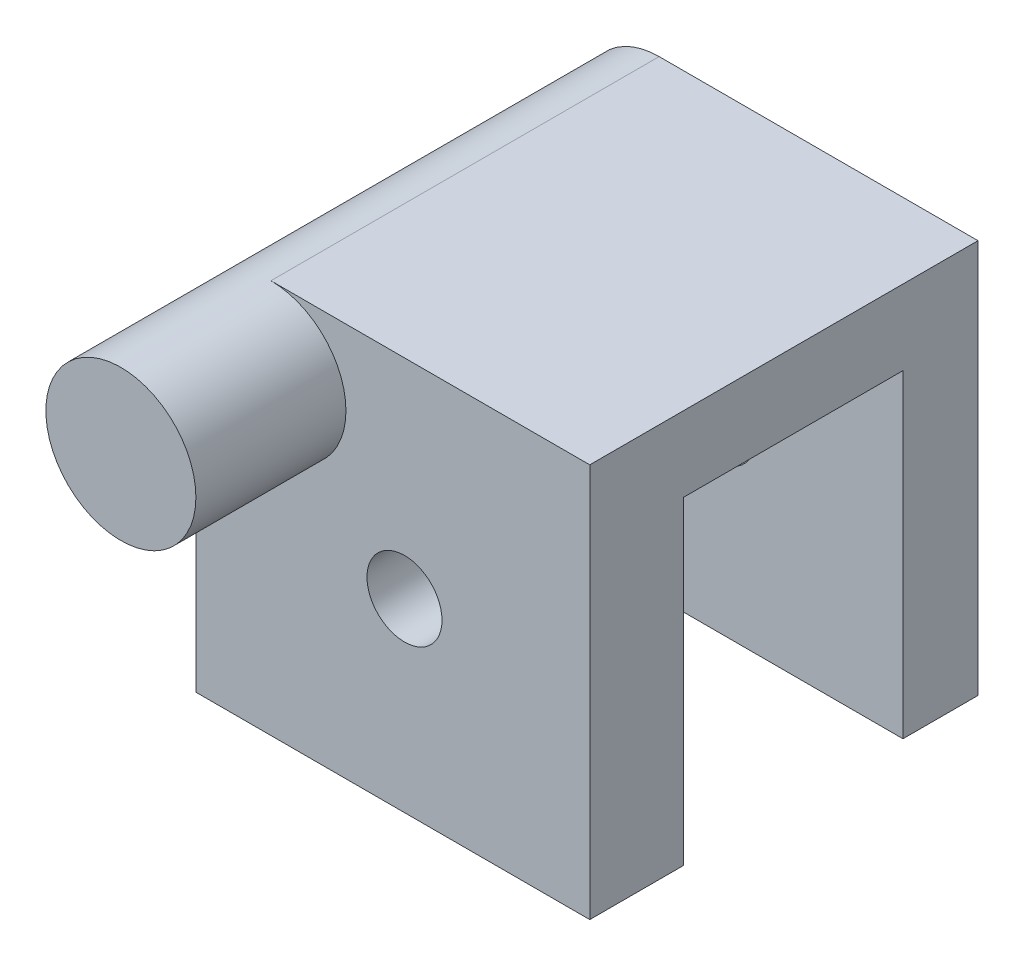
ISO-10303-21;
HEADER;
FILE_DESCRIPTION(('STEP AP214'),'2;1');
FILE_NAME('part.step','',(''),(''),'','','');
FILE_SCHEMA(('AUTOMOTIVE_DESIGN { 1 0 10303 214 1 1 1 1 }'));
ENDSEC;
DATA;
#1=APPLICATION_CONTEXT('core data for automotive mechanical design processes');
#2=APPLICATION_PROTOCOL_DEFINITION('international standard','automotive_design',2000,#1);
#3=PRODUCT_CONTEXT('',#1,'mechanical');
#4=PRODUCT('Part','Part','',(#3));
#5=PRODUCT_RELATED_PRODUCT_CATEGORY('part','',(#4));
#6=PRODUCT_DEFINITION_FORMATION('','',#4);
#7=PRODUCT_DEFINITION_CONTEXT('part definition',#1,'design');
#8=PRODUCT_DEFINITION('design','',#6,#7);
#9=PRODUCT_DEFINITION_SHAPE('','',#8);
#10=(LENGTH_UNIT() NAMED_UNIT(*) SI_UNIT(.MILLI.,.METRE.));
#11=(NAMED_UNIT(*) PLANE_ANGLE_UNIT() SI_UNIT($,.RADIAN.));
#12=(NAMED_UNIT(*) SI_UNIT($,.STERADIAN.) SOLID_ANGLE_UNIT());
#13=UNCERTAINTY_MEASURE_WITH_UNIT(LENGTH_MEASURE(1.E-05),#10,'distance_accuracy_value','');
#14=(GEOMETRIC_REPRESENTATION_CONTEXT(3) GLOBAL_UNCERTAINTY_ASSIGNED_CONTEXT((#13)) GLOBAL_UNIT_ASSIGNED_CONTEXT((#10,
#11,#12)) REPRESENTATION_CONTEXT('',''));
#15=CARTESIAN_POINT('',(0.,0.,0.));
#16=DIRECTION('',(0.,0.,1.));
#17=DIRECTION('',(1.,0.,0.));
#18=AXIS2_PLACEMENT_3D('',#15,#16,#17);
#19=CARTESIAN_POINT('',(-46.,0.,-41.398484809835));
#20=DIRECTION('',(1.,0.,0.));
#21=DIRECTION('',(0.,0.,-1.));
#22=AXIS2_PLACEMENT_3D('',#19,#20,#21);
#23=PLANE('',#22);
#24=DIRECTION('',(0.,0.,1.));
#25=VECTOR('',#24,1.);
#26=CARTESIAN_POINT('',(-46.,-21.,-41.398484809835));
#27=LINE('',#26,#25);
#28=CARTESIAN_POINT('',(-46.,-21.,-11.7));
#29=VERTEX_POINT('',#28);
#30=CARTESIAN_POINT('',(-46.,-21.,0.));
#31=VERTEX_POINT('',#30);
#32=EDGE_CURVE('E233',#29,#31,#27,.T.);
#33=ORIENTED_EDGE('',*,*,#32,.F.);
#34=DIRECTION('',(0.,1.,0.));
#35=VECTOR('',#34,1.);
#36=CARTESIAN_POINT('',(-46.,0.,-11.7));
#37=LINE('',#36,#35);
#38=CARTESIAN_POINT('',(-46.,-8.00000000000001,-11.7));
#39=VERTEX_POINT('',#38);
#40=EDGE_CURVE('E82',#29,#39,#37,.T.);
#41=ORIENTED_EDGE('',*,*,#40,.T.);
#42=DIRECTION('',(0.,0.,1.));
#43=VECTOR('',#42,1.);
#44=CARTESIAN_POINT('',(-46.,-8.00000000000001,-41.398484809835));
#45=LINE('',#44,#43);
#46=CARTESIAN_POINT('',(-46.,-8.00000000000001,0.));
#47=VERTEX_POINT('',#46);
#48=EDGE_CURVE('E231',#39,#47,#45,.T.);
#49=ORIENTED_EDGE('',*,*,#48,.T.);
#50=DIRECTION('',(0.,-1.,0.));
#51=VECTOR('',#50,1.);
#52=CARTESIAN_POINT('',(-46.,0.,0.));
#53=LINE('',#52,#51);
#54=EDGE_CURVE('E213',#47,#31,#53,.T.);
#55=ORIENTED_EDGE('',*,*,#54,.T.);
#56=EDGE_LOOP('',(#33,#41,#49,#55));
#57=FACE_BOUND('',#56,.T.);
#58=ADVANCED_FACE('F67',(#57),#23,.T.);
#59=CARTESIAN_POINT('',(0.,-4.,-41.398484809835));
#60=DIRECTION('',(0.,1.,0.));
#61=DIRECTION('',(0.,0.,1.));
#62=AXIS2_PLACEMENT_3D('',#59,#60,#61);
#63=PLANE('',#62);
#64=DIRECTION('',(-1.,0.,0.));
#65=VECTOR('',#64,1.);
#66=CARTESIAN_POINT('',(0.,-4.,-11.7));
#67=LINE('',#66,#65);
#68=CARTESIAN_POINT('',(-29.,-4.,-11.7));
#69=VERTEX_POINT('',#68);
#70=CARTESIAN_POINT('',(-42.,-4.,-11.7));
#71=VERTEX_POINT('',#70);
#72=EDGE_CURVE('E90',#69,#71,#67,.T.);
#73=ORIENTED_EDGE('',*,*,#72,.F.);
#74=DIRECTION('',(0.,0.,1.));
#75=VECTOR('',#74,1.);
#76=CARTESIAN_POINT('',(-29.,-4.,-41.398484809835));
#77=LINE('',#76,#75);
#78=CARTESIAN_POINT('',(-29.,-4.,0.));
#79=VERTEX_POINT('',#78);
#80=EDGE_CURVE('E235',#69,#79,#77,.T.);
#81=ORIENTED_EDGE('',*,*,#80,.T.);
#82=DIRECTION('',(1.,0.,0.));
#83=VECTOR('',#82,1.);
#84=CARTESIAN_POINT('',(0.,-4.,0.));
#85=LINE('',#84,#83);
#86=CARTESIAN_POINT('',(-42.,-4.,0.));
#87=VERTEX_POINT('',#86);
#88=EDGE_CURVE('E206',#87,#79,#85,.T.);
#89=ORIENTED_EDGE('',*,*,#88,.F.);
#90=DIRECTION('',(0.,0.,1.));
#91=VECTOR('',#90,1.);
#92=CARTESIAN_POINT('',(-42.,-4.,-41.398484809835));
#93=LINE('',#92,#91);
#94=EDGE_CURVE('E230',#71,#87,#93,.T.);
#95=ORIENTED_EDGE('',*,*,#94,.F.);
#96=EDGE_LOOP('',(#73,#81,#89,#95));
#97=FACE_BOUND('',#96,.T.);
#98=ADVANCED_FACE('F263',(#97),#63,.F.);
#99=CARTESIAN_POINT('',(-46.,-4.,-41.398484809835));
#100=DIRECTION('',(0.,0.,1.));
#101=DIRECTION('',(1.,0.,0.));
#102=AXIS2_PLACEMENT_3D('',#99,#100,#101);
#103=CYLINDRICAL_SURFACE('',#102,4.00000000000001);
#104=ORIENTED_EDGE('',*,*,#94,.T.);
#105=CARTESIAN_POINT('',(-46.,-4.,0.));
#106=DIRECTION('',(0.,0.,1.));
#107=DIRECTION('',(1.,0.,0.));
#108=AXIS2_PLACEMENT_3D('',#105,#106,#107);
#109=CIRCLE('',#108,4.00000000000001);
#110=EDGE_CURVE('E187',#47,#87,#109,.T.);
#111=ORIENTED_EDGE('',*,*,#110,.F.);
#112=ORIENTED_EDGE('',*,*,#48,.F.);
#113=CARTESIAN_POINT('',(-46.,-4.,-11.7));
#114=DIRECTION('',(0.,0.,-1.));
#115=DIRECTION('',(0.,1.,0.));
#116=AXIS2_PLACEMENT_3D('',#113,#114,#115);
#117=CIRCLE('',#116,4.00000000000001);
#118=EDGE_CURVE('E227',#39,#71,#117,.F.);
#119=ORIENTED_EDGE('',*,*,#118,.T.);
#120=EDGE_LOOP('',(#104,#111,#112,#119));
#121=FACE_BOUND('',#120,.T.);
#122=ADVANCED_FACE('F265',(#121),#103,.T.);
#123=DIRECTION('',(0.,0.,1.));
#124=VECTOR('',#123,1.);
#125=CARTESIAN_POINT('',(-50.,-4.,-41.398484809835));
#126=LINE('',#125,#124);
#127=CARTESIAN_POINT('',(-50.,-4.,-15.7));
#128=VERTEX_POINT('',#127);
#129=CARTESIAN_POINT('',(-50.,-4.,5.));
#130=VERTEX_POINT('',#129);
#131=EDGE_CURVE('E226',#128,#130,#126,.T.);
#132=ORIENTED_EDGE('',*,*,#131,.T.);
#133=CARTESIAN_POINT('',(-46.,-4.,5.));
#134=DIRECTION('',(0.,0.,1.));
#135=DIRECTION('',(1.,0.,0.));
#136=AXIS2_PLACEMENT_3D('',#133,#134,#135);
#137=CIRCLE('',#136,4.00000000000001);
#138=CARTESIAN_POINT('',(-46.,0.,5.));
#139=VERTEX_POINT('',#138);
#140=EDGE_CURVE('E188',#130,#139,#137,.T.);
#141=ORIENTED_EDGE('',*,*,#140,.T.);
#142=DIRECTION('',(0.,0.,1.));
#143=VECTOR('',#142,1.);
#144=CARTESIAN_POINT('',(-46.,0.,-41.398484809835));
#145=LINE('',#144,#143);
#146=CARTESIAN_POINT('',(-46.,0.,-15.7));
#147=VERTEX_POINT('',#146);
#148=EDGE_CURVE('E12',#147,#139,#145,.T.);
#149=ORIENTED_EDGE('',*,*,#148,.F.);
#150=CARTESIAN_POINT('',(-46.,-4.,-15.7));
#151=DIRECTION('',(0.,0.,-1.));
#152=DIRECTION('',(0.,1.,0.));
#153=AXIS2_PLACEMENT_3D('',#150,#151,#152);
#154=CIRCLE('',#153,4.00000000000001);
#155=EDGE_CURVE('E222',#128,#147,#154,.T.);
#156=ORIENTED_EDGE('',*,*,#155,.F.);
#157=EDGE_LOOP('',(#132,#141,#149,#156));
#158=FACE_BOUND('',#157,.T.);
#159=CARTESIAN_POINT('',(-46.,-4.,13.));
#160=DIRECTION('',(0.,0.,1.));
#161=DIRECTION('',(1.,0.,0.));
#162=AXIS2_PLACEMENT_3D('',#159,#160,#161);
#163=CIRCLE('',#162,4.00000000000001);
#164=CARTESIAN_POINT('',(-42.,-4.,13.));
#165=VERTEX_POINT('',#164);
#166=EDGE_CURVE('E182',#165,#165,#163,.T.);
#167=ORIENTED_EDGE('',*,*,#166,.F.);
#168=EDGE_LOOP('',(#167));
#169=FACE_BOUND('',#168,.T.);
#170=ADVANCED_FACE('F69',(#158,#169),#103,.T.);
#171=CARTESIAN_POINT('',(-50.,0.,-41.398484809835));
#172=DIRECTION('',(1.,0.,0.));
#173=DIRECTION('',(0.,0.,-1.));
#174=AXIS2_PLACEMENT_3D('',#171,#172,#173);
#175=PLANE('',#174);
#176=ORIENTED_EDGE('',*,*,#131,.F.);
#177=DIRECTION('',(0.,-1.,0.));
#178=VECTOR('',#177,1.);
#179=CARTESIAN_POINT('',(-50.,0.,-15.7));
#180=LINE('',#179,#178);
#181=CARTESIAN_POINT('',(-50.,-21.,-15.7));
#182=VERTEX_POINT('',#181);
#183=EDGE_CURVE('E155',#128,#182,#180,.T.);
#184=ORIENTED_EDGE('',*,*,#183,.T.);
#185=DIRECTION('',(0.,0.,1.));
#186=VECTOR('',#185,1.);
#187=CARTESIAN_POINT('',(-50.,-21.,-41.398484809835));
#188=LINE('',#187,#186);
#189=CARTESIAN_POINT('',(-50.,-21.,5.));
#190=VERTEX_POINT('',#189);
#191=EDGE_CURVE('E151',#182,#190,#188,.T.);
#192=ORIENTED_EDGE('',*,*,#191,.T.);
#193=DIRECTION('',(0.,1.,0.));
#194=VECTOR('',#193,1.);
#195=CARTESIAN_POINT('',(-50.,0.,5.));
#196=LINE('',#195,#194);
#197=EDGE_CURVE('E191',#190,#130,#196,.T.);
#198=ORIENTED_EDGE('',*,*,#197,.T.);
#199=EDGE_LOOP('',(#176,#184,#192,#198));
#200=FACE_BOUND('',#199,.T.);
#201=ADVANCED_FACE('F253',(#200),#175,.F.);
#202=CARTESIAN_POINT('',(0.,-21.,-41.398484809835));
#203=DIRECTION('',(0.,1.,0.));
#204=DIRECTION('',(-1.,0.,0.));
#205=AXIS2_PLACEMENT_3D('',#202,#203,#204);
#206=PLANE('',#205);
#207=ORIENTED_EDGE('',*,*,#191,.F.);
#208=DIRECTION('',(1.,0.,0.));
#209=VECTOR('',#208,1.);
#210=CARTESIAN_POINT('',(0.,-21.,-15.7));
#211=LINE('',#210,#209);
#212=CARTESIAN_POINT('',(-29.,-21.,-15.7));
#213=VERTEX_POINT('',#212);
#214=EDGE_CURVE('E143',#182,#213,#211,.T.);
#215=ORIENTED_EDGE('',*,*,#214,.T.);
#216=DIRECTION('',(0.,0.,-1.));
#217=VECTOR('',#216,1.);
#218=CARTESIAN_POINT('',(-29.,-21.,12.3416305603426));
#219=LINE('',#218,#217);
#220=CARTESIAN_POINT('',(-29.,-21.,-11.7));
#221=VERTEX_POINT('',#220);
#222=EDGE_CURVE('E148',#221,#213,#219,.T.);
#223=ORIENTED_EDGE('',*,*,#222,.F.);
#224=DIRECTION('',(1.,0.,0.));
#225=VECTOR('',#224,1.);
#226=CARTESIAN_POINT('',(-46.,-21.,-11.7));
#227=LINE('',#226,#225);
#228=EDGE_CURVE('E172',#29,#221,#227,.T.);
#229=ORIENTED_EDGE('',*,*,#228,.F.);
#230=ORIENTED_EDGE('',*,*,#32,.T.);
#231=DIRECTION('',(1.,0.,0.));
#232=VECTOR('',#231,1.);
#233=CARTESIAN_POINT('',(0.,-21.,0.));
#234=LINE('',#233,#232);
#235=CARTESIAN_POINT('',(-28.9999999999999,-21.,0.));
#236=VERTEX_POINT('',#235);
#237=EDGE_CURVE('E180',#31,#236,#234,.T.);
#238=ORIENTED_EDGE('',*,*,#237,.T.);
#239=DIRECTION('',(0.,0.,1.));
#240=VECTOR('',#239,1.);
#241=CARTESIAN_POINT('',(-28.9999999999999,-21.,-24.0416305603426));
#242=LINE('',#241,#240);
#243=CARTESIAN_POINT('',(-28.9999999999999,-21.,5.00000000000012));
#244=VERTEX_POINT('',#243);
#245=EDGE_CURVE('E176',#236,#244,#242,.T.);
#246=ORIENTED_EDGE('',*,*,#245,.T.);
#247=DIRECTION('',(-1.,0.,0.));
#248=VECTOR('',#247,1.);
#249=CARTESIAN_POINT('',(0.,-21.,5.));
#250=LINE('',#249,#248);
#251=EDGE_CURVE('E195',#244,#190,#250,.T.);
#252=ORIENTED_EDGE('',*,*,#251,.T.);
#253=EDGE_LOOP('',(#207,#215,#223,#229,#230,#238,#246,#252));
#254=FACE_BOUND('',#253,.T.);
#255=ADVANCED_FACE('F145',(#254),#206,.F.);
#256=CARTESIAN_POINT('',(-29.,0.,-41.398484809835));
#257=DIRECTION('',(1.,0.,0.));
#258=DIRECTION('',(0.,0.,-1.));
#259=AXIS2_PLACEMENT_3D('',#256,#257,#258);
#260=PLANE('',#259);
#261=ORIENTED_EDGE('',*,*,#80,.F.);
#262=DIRECTION('',(0.,-1.,0.));
#263=VECTOR('',#262,1.);
#264=CARTESIAN_POINT('',(-29.,-3.99999999999999,-11.7));
#265=LINE('',#264,#263);
#266=EDGE_CURVE('E170',#69,#221,#265,.T.);
#267=ORIENTED_EDGE('',*,*,#266,.T.);
#268=ORIENTED_EDGE('',*,*,#222,.T.);
#269=DIRECTION('',(0.,-1.,0.));
#270=VECTOR('',#269,1.);
#271=CARTESIAN_POINT('',(-29.,0.,-15.7));
#272=LINE('',#271,#270);
#273=CARTESIAN_POINT('',(-29.,0.,-15.7));
#274=VERTEX_POINT('',#273);
#275=EDGE_CURVE('E156',#274,#213,#272,.T.);
#276=ORIENTED_EDGE('',*,*,#275,.F.);
#277=DIRECTION('',(0.,0.,1.));
#278=VECTOR('',#277,1.);
#279=CARTESIAN_POINT('',(-29.,0.,-41.398484809835));
#280=LINE('',#279,#278);
#281=CARTESIAN_POINT('',(-29.,0.,5.));
#282=VERTEX_POINT('',#281);
#283=EDGE_CURVE('E75',#274,#282,#280,.T.);
#284=ORIENTED_EDGE('',*,*,#283,.T.);
#285=DIRECTION('',(0.,1.,0.));
#286=VECTOR('',#285,1.);
#287=CARTESIAN_POINT('',(-29.,0.,5.));
#288=LINE('',#287,#286);
#289=EDGE_CURVE('E197',#244,#282,#288,.T.);
#290=ORIENTED_EDGE('',*,*,#289,.F.);
#291=ORIENTED_EDGE('',*,*,#245,.F.);
#292=DIRECTION('',(0.,-1.,0.));
#293=VECTOR('',#292,1.);
#294=CARTESIAN_POINT('',(-29.,0.,0.));
#295=LINE('',#294,#293);
#296=EDGE_CURVE('E179',#79,#236,#295,.T.);
#297=ORIENTED_EDGE('',*,*,#296,.F.);
#298=EDGE_LOOP('',(#261,#267,#268,#276,#284,#290,#291,#297));
#299=FACE_BOUND('',#298,.T.);
#300=ADVANCED_FACE('F168',(#299),#260,.T.);
#301=CARTESIAN_POINT('',(0.,0.,-41.398484809835));
#302=DIRECTION('',(0.,1.,0.));
#303=DIRECTION('',(-1.,0.,0.));
#304=AXIS2_PLACEMENT_3D('',#301,#302,#303);
#305=PLANE('',#304);
#306=ORIENTED_EDGE('',*,*,#283,.F.);
#307=DIRECTION('',(1.,0.,0.));
#308=VECTOR('',#307,1.);
#309=CARTESIAN_POINT('',(0.,0.,-15.7));
#310=LINE('',#309,#308);
#311=EDGE_CURVE('E164',#147,#274,#310,.T.);
#312=ORIENTED_EDGE('',*,*,#311,.F.);
#313=ORIENTED_EDGE('',*,*,#148,.T.);
#314=DIRECTION('',(-1.,0.,0.));
#315=VECTOR('',#314,1.);
#316=CARTESIAN_POINT('',(0.,0.,5.));
#317=LINE('',#316,#315);
#318=EDGE_CURVE('E200',#282,#139,#317,.T.);
#319=ORIENTED_EDGE('',*,*,#318,.F.);
#320=EDGE_LOOP('',(#306,#312,#313,#319));
#321=FACE_BOUND('',#320,.T.);
#322=ADVANCED_FACE('F255',(#321),#305,.T.);
#323=CARTESIAN_POINT('',(-46.,-4.,-11.7));
#324=DIRECTION('',(0.,0.,-1.));
#325=DIRECTION('',(0.,1.,0.));
#326=AXIS2_PLACEMENT_3D('',#323,#324,#325);
#327=PLANE('',#326);
#328=ORIENTED_EDGE('',*,*,#266,.F.);
#329=ORIENTED_EDGE('',*,*,#72,.T.);
#330=ORIENTED_EDGE('',*,*,#118,.F.);
#331=ORIENTED_EDGE('',*,*,#40,.F.);
#332=ORIENTED_EDGE('',*,*,#228,.T.);
#333=EDGE_LOOP('',(#328,#329,#330,#331,#332));
#334=FACE_BOUND('',#333,.T.);
#335=CARTESIAN_POINT('',(-38.8786796564403,-11.1213203435596,-11.7));
#336=DIRECTION('',(0.,0.,-1.));
#337=DIRECTION('',(0.,1.,0.));
#338=AXIS2_PLACEMENT_3D('',#335,#336,#337);
#339=CIRCLE('',#338,2.);
#340=CARTESIAN_POINT('',(-36.8786796564403,-11.1213203435596,-11.7));
#341=VERTEX_POINT('',#340);
#342=EDGE_CURVE('E216',#341,#341,#339,.T.);
#343=ORIENTED_EDGE('',*,*,#342,.T.);
#344=EDGE_LOOP('',(#343));
#345=FACE_BOUND('',#344,.T.);
#346=ADVANCED_FACE('F267',(#334,#345),#327,.F.);
#347=CARTESIAN_POINT('',(-46.,-4.,-15.7));
#348=DIRECTION('',(0.,0.,-1.));
#349=DIRECTION('',(0.,1.,0.));
#350=AXIS2_PLACEMENT_3D('',#347,#348,#349);
#351=PLANE('',#350);
#352=ORIENTED_EDGE('',*,*,#275,.T.);
#353=ORIENTED_EDGE('',*,*,#214,.F.);
#354=ORIENTED_EDGE('',*,*,#183,.F.);
#355=ORIENTED_EDGE('',*,*,#155,.T.);
#356=ORIENTED_EDGE('',*,*,#311,.T.);
#357=EDGE_LOOP('',(#352,#353,#354,#355,#356));
#358=FACE_BOUND('',#357,.T.);
#359=CARTESIAN_POINT('',(-38.8786796564403,-11.1213203435596,-15.7));
#360=DIRECTION('',(0.,0.,-1.));
#361=DIRECTION('',(0.,1.,0.));
#362=AXIS2_PLACEMENT_3D('',#359,#360,#361);
#363=CIRCLE('',#362,2.);
#364=CARTESIAN_POINT('',(-36.8786796564403,-11.1213203435596,-15.7));
#365=VERTEX_POINT('',#364);
#366=EDGE_CURVE('E166',#365,#365,#363,.T.);
#367=ORIENTED_EDGE('',*,*,#366,.F.);
#368=EDGE_LOOP('',(#367));
#369=FACE_BOUND('',#368,.T.);
#370=ADVANCED_FACE('F160',(#358,#369),#351,.T.);
#371=CARTESIAN_POINT('',(-38.8786796564403,-11.1213203435596,-15.7));
#372=DIRECTION('',(0.,0.,1.));
#373=DIRECTION('',(1.,0.,0.));
#374=AXIS2_PLACEMENT_3D('',#371,#372,#373);
#375=CYLINDRICAL_SURFACE('',#374,2.);
#376=CARTESIAN_POINT('',(-36.8786796564403,-11.1213203435596,-15.7));
#377=CARTESIAN_POINT('',(-36.8786796564403,-11.1213203435596,-15.6583333333333));
#378=CARTESIAN_POINT('',(-36.8786796564403,-11.1213203435596,-15.6166666666667));
#379=CARTESIAN_POINT('',(-36.8786796564403,-11.1213203435596,-15.5333333333333));
#380=CARTESIAN_POINT('',(-36.8786796564403,-11.1213203435596,-15.4916666666667));
#381=CARTESIAN_POINT('',(-36.8786796564403,-11.1213203435596,-15.4083333333333));
#382=CARTESIAN_POINT('',(-36.8786796564403,-11.1213203435596,-15.3666666666667));
#383=CARTESIAN_POINT('',(-36.8786796564403,-11.1213203435596,-15.2833333333333));
#384=CARTESIAN_POINT('',(-36.8786796564403,-11.1213203435596,-15.2416666666667));
#385=CARTESIAN_POINT('',(-36.8786796564403,-11.1213203435596,-15.1583333333333));
#386=CARTESIAN_POINT('',(-36.8786796564403,-11.1213203435596,-15.1166666666667));
#387=CARTESIAN_POINT('',(-36.8786796564403,-11.1213203435596,-15.0333333333333));
#388=CARTESIAN_POINT('',(-36.8786796564403,-11.1213203435596,-14.9916666666667));
#389=CARTESIAN_POINT('',(-36.8786796564403,-11.1213203435596,-14.9083333333333));
#390=CARTESIAN_POINT('',(-36.8786796564403,-11.1213203435596,-14.8666666666667));
#391=CARTESIAN_POINT('',(-36.8786796564403,-11.1213203435596,-14.7833333333333));
#392=CARTESIAN_POINT('',(-36.8786796564403,-11.1213203435596,-14.7416666666667));
#393=CARTESIAN_POINT('',(-36.8786796564403,-11.1213203435596,-14.6583333333333));
#394=CARTESIAN_POINT('',(-36.8786796564403,-11.1213203435596,-14.6166666666667));
#395=CARTESIAN_POINT('',(-36.8786796564403,-11.1213203435596,-14.5333333333333));
#396=CARTESIAN_POINT('',(-36.8786796564403,-11.1213203435596,-14.4916666666667));
#397=CARTESIAN_POINT('',(-36.8786796564403,-11.1213203435596,-14.4083333333333));
#398=CARTESIAN_POINT('',(-36.8786796564403,-11.1213203435596,-14.3666666666667));
#399=CARTESIAN_POINT('',(-36.8786796564403,-11.1213203435596,-14.2833333333333));
#400=CARTESIAN_POINT('',(-36.8786796564403,-11.1213203435596,-14.2416666666667));
#401=CARTESIAN_POINT('',(-36.8786796564403,-11.1213203435596,-14.1583333333333));
#402=CARTESIAN_POINT('',(-36.8786796564403,-11.1213203435596,-14.1166666666667));
#403=CARTESIAN_POINT('',(-36.8786796564403,-11.1213203435596,-14.0333333333333));
#404=CARTESIAN_POINT('',(-36.8786796564403,-11.1213203435596,-13.9916666666667));
#405=CARTESIAN_POINT('',(-36.8786796564403,-11.1213203435596,-13.9083333333333));
#406=CARTESIAN_POINT('',(-36.8786796564403,-11.1213203435596,-13.8666666666667));
#407=CARTESIAN_POINT('',(-36.8786796564403,-11.1213203435596,-13.7833333333333));
#408=CARTESIAN_POINT('',(-36.8786796564403,-11.1213203435596,-13.7416666666667));
#409=CARTESIAN_POINT('',(-36.8786796564403,-11.1213203435596,-13.6583333333333));
#410=CARTESIAN_POINT('',(-36.8786796564403,-11.1213203435596,-13.6166666666667));
#411=CARTESIAN_POINT('',(-36.8786796564403,-11.1213203435596,-13.5333333333333));
#412=CARTESIAN_POINT('',(-36.8786796564403,-11.1213203435596,-13.4916666666667));
#413=CARTESIAN_POINT('',(-36.8786796564403,-11.1213203435596,-13.4083333333333));
#414=CARTESIAN_POINT('',(-36.8786796564403,-11.1213203435596,-13.3666666666667));
#415=CARTESIAN_POINT('',(-36.8786796564403,-11.1213203435596,-13.2833333333333));
#416=CARTESIAN_POINT('',(-36.8786796564403,-11.1213203435596,-13.2416666666667));
#417=CARTESIAN_POINT('',(-36.8786796564403,-11.1213203435596,-13.1583333333333));
#418=CARTESIAN_POINT('',(-36.8786796564403,-11.1213203435596,-13.1166666666667));
#419=CARTESIAN_POINT('',(-36.8786796564403,-11.1213203435596,-13.0333333333333));
#420=CARTESIAN_POINT('',(-36.8786796564403,-11.1213203435596,-12.9916666666667));
#421=CARTESIAN_POINT('',(-36.8786796564403,-11.1213203435596,-12.9083333333333));
#422=CARTESIAN_POINT('',(-36.8786796564403,-11.1213203435596,-12.8666666666667));
#423=CARTESIAN_POINT('',(-36.8786796564403,-11.1213203435596,-12.7833333333333));
#424=CARTESIAN_POINT('',(-36.8786796564403,-11.1213203435596,-12.7416666666667));
#425=CARTESIAN_POINT('',(-36.8786796564403,-11.1213203435596,-12.6583333333333));
#426=CARTESIAN_POINT('',(-36.8786796564403,-11.1213203435596,-12.6166666666667));
#427=CARTESIAN_POINT('',(-36.8786796564403,-11.1213203435596,-12.5333333333333));
#428=CARTESIAN_POINT('',(-36.8786796564403,-11.1213203435596,-12.4916666666667));
#429=CARTESIAN_POINT('',(-36.8786796564403,-11.1213203435596,-12.4083333333333));
#430=CARTESIAN_POINT('',(-36.8786796564403,-11.1213203435596,-12.3666666666667));
#431=CARTESIAN_POINT('',(-36.8786796564403,-11.1213203435596,-12.2833333333333));
#432=CARTESIAN_POINT('',(-36.8786796564403,-11.1213203435596,-12.2416666666667));
#433=CARTESIAN_POINT('',(-36.8786796564403,-11.1213203435596,-12.1583333333333));
#434=CARTESIAN_POINT('',(-36.8786796564403,-11.1213203435596,-12.1166666666667));
#435=CARTESIAN_POINT('',(-36.8786796564403,-11.1213203435596,-12.0333333333333));
#436=CARTESIAN_POINT('',(-36.8786796564403,-11.1213203435596,-11.9916666666667));
#437=CARTESIAN_POINT('',(-36.8786796564403,-11.1213203435596,-11.9083333333333));
#438=CARTESIAN_POINT('',(-36.8786796564403,-11.1213203435596,-11.8666666666667));
#439=CARTESIAN_POINT('',(-36.8786796564403,-11.1213203435596,-11.7833333333333));
#440=CARTESIAN_POINT('',(-36.8786796564403,-11.1213203435596,-11.7416666666667));
#441=CARTESIAN_POINT('',(-36.8786796564403,-11.1213203435596,-11.7));
#442=B_SPLINE_CURVE_WITH_KNOTS('',3,(#376,#377,#378,#379,#380,#381,#382,#383,#384,#385,#386,
#387,#388,#389,#390,#391,#392,#393,#394,#395,#396,#397,#398,#399,#400,#401,#402,#403,#404,#405,
#406,#407,#408,#409,#410,#411,#412,#413,#414,#415,#416,#417,#418,#419,#420,#421,#422,#423,#424,
#425,#426,#427,#428,#429,#430,#431,#432,#433,#434,#435,#436,#437,#438,#439,#440,#441),
.UNSPECIFIED.,.F.,.F.,(4,2,2,2,2,2,2,2,2,2,2,2,2,2,2,2,2,2,2,2,2,2,2,2,2,2,2,2,2,2,2,2,4),(0.,
0.124999999999998,0.249999999999999,0.374999999999999,0.499999999999999,0.624999999999999,
0.749999999999999,0.874999999999999,0.999999999999997,1.125,1.25,1.375,1.5,1.625,1.75,1.875,2.,
2.125,2.25,2.375,2.5,2.625,2.75,2.875,3.,3.125,3.25,3.375,3.5,3.625,3.75,3.875,4.),.UNSPECIFIED.);
#443=EDGE_CURVE('BSEAM332',#365,#341,#442,.T.);
#444=ORIENTED_EDGE('',*,*,#366,.T.);
#445=ORIENTED_EDGE('',*,*,#342,.F.);
#446=ORIENTED_EDGE('',*,*,#443,.T.);
#447=ORIENTED_EDGE('',*,*,#443,.F.);
#448=EDGE_LOOP('',(#444,#446,#445,#447));
#449=FACE_BOUND('',#448,.T.);
#450=ADVANCED_FACE('F332',(#449),#375,.F.);
#451=CARTESIAN_POINT('',(0.,0.,0.));
#452=DIRECTION('',(0.,0.,1.));
#453=DIRECTION('',(1.,0.,0.));
#454=AXIS2_PLACEMENT_3D('',#451,#452,#453);
#455=PLANE('',#454);
#456=ORIENTED_EDGE('',*,*,#54,.F.);
#457=ORIENTED_EDGE('',*,*,#110,.T.);
#458=ORIENTED_EDGE('',*,*,#88,.T.);
#459=ORIENTED_EDGE('',*,*,#296,.T.);
#460=ORIENTED_EDGE('',*,*,#237,.F.);
#461=EDGE_LOOP('',(#456,#457,#458,#459,#460));
#462=FACE_BOUND('',#461,.T.);
#463=CARTESIAN_POINT('',(-38.8786796564403,-11.1213203435596,0.));
#464=DIRECTION('',(0.,0.,1.));
#465=DIRECTION('',(1.,0.,0.));
#466=AXIS2_PLACEMENT_3D('',#463,#464,#465);
#467=CIRCLE('',#466,2.);
#468=CARTESIAN_POINT('',(-36.8786796564403,-11.1213203435596,0.));
#469=VERTEX_POINT('',#468);
#470=EDGE_CURVE('E192',#469,#469,#467,.T.);
#471=ORIENTED_EDGE('',*,*,#470,.T.);
#472=EDGE_LOOP('',(#471));
#473=FACE_BOUND('',#472,.T.);
#474=ADVANCED_FACE('F261',(#462,#473),#455,.F.);
#475=CARTESIAN_POINT('',(-38.8786796564403,-11.1213203435596,5.));
#476=DIRECTION('',(0.,0.,-1.));
#477=DIRECTION('',(-1.,0.,0.));
#478=AXIS2_PLACEMENT_3D('',#475,#476,#477);
#479=CYLINDRICAL_SURFACE('',#478,2.);
#480=CARTESIAN_POINT('',(-38.8786796564403,-11.1213203435596,5.));
#481=DIRECTION('',(0.,0.,1.));
#482=DIRECTION('',(1.,0.,0.));
#483=AXIS2_PLACEMENT_3D('',#480,#481,#482);
#484=CIRCLE('',#483,2.);
#485=CARTESIAN_POINT('',(-36.8786796564403,-11.1213203435596,5.));
#486=VERTEX_POINT('',#485);
#487=EDGE_CURVE('E203',#486,#486,#484,.T.);
#488=ORIENTED_EDGE('',*,*,#487,.T.);
#489=EDGE_LOOP('',(#488));
#490=FACE_BOUND('',#489,.T.);
#491=ORIENTED_EDGE('',*,*,#470,.F.);
#492=EDGE_LOOP('',(#491));
#493=FACE_BOUND('',#492,.T.);
#494=ADVANCED_FACE('F348',(#490,#493),#479,.F.);
#495=CARTESIAN_POINT('',(0.,0.,5.));
#496=DIRECTION('',(0.,0.,1.));
#497=DIRECTION('',(1.,0.,0.));
#498=AXIS2_PLACEMENT_3D('',#495,#496,#497);
#499=PLANE('',#498);
#500=ORIENTED_EDGE('',*,*,#140,.F.);
#501=ORIENTED_EDGE('',*,*,#197,.F.);
#502=ORIENTED_EDGE('',*,*,#251,.F.);
#503=ORIENTED_EDGE('',*,*,#289,.T.);
#504=ORIENTED_EDGE('',*,*,#318,.T.);
#505=EDGE_LOOP('',(#500,#501,#502,#503,#504));
#506=FACE_BOUND('',#505,.T.);
#507=ORIENTED_EDGE('',*,*,#487,.F.);
#508=EDGE_LOOP('',(#507));
#509=FACE_BOUND('',#508,.T.);
#510=ADVANCED_FACE('F249',(#506,#509),#499,.T.);
#511=CARTESIAN_POINT('',(-46.,-4.,13.));
#512=DIRECTION('',(0.,0.,1.));
#513=DIRECTION('',(1.,0.,0.));
#514=AXIS2_PLACEMENT_3D('',#511,#512,#513);
#515=PLANE('',#514);
#516=ORIENTED_EDGE('',*,*,#166,.T.);
#517=EDGE_LOOP('',(#516));
#518=FACE_BOUND('',#517,.T.);
#519=ADVANCED_FACE('F363',(#518),#515,.T.);
#520=CLOSED_SHELL('',(#58,#98,#122,#170,#201,#255,#300,#322,#346,#370,#450,#474,#494,#510,#519));
#521=MANIFOLD_SOLID_BREP('B2',#520);
#522=ADVANCED_BREP_SHAPE_REPRESENTATION('',(#18,#521),#14);
#523=SHAPE_DEFINITION_REPRESENTATION(#9,#522);
ENDSEC;
END-ISO-10303-21;
